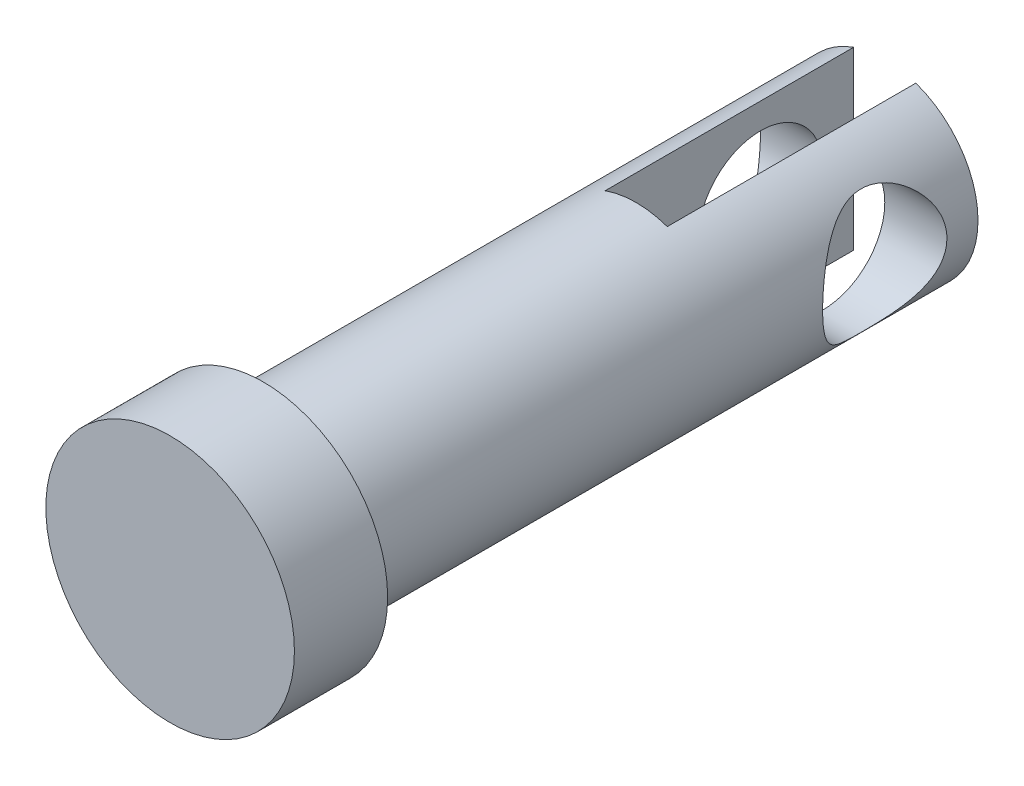
ISO-10303-21;
HEADER;
FILE_DESCRIPTION(('STEP AP214'),'2;1');
FILE_NAME('part.step','',(''),(''),'','','');
FILE_SCHEMA(('AUTOMOTIVE_DESIGN { 1 0 10303 214 1 1 1 1 }'));
ENDSEC;
DATA;
#1=APPLICATION_CONTEXT('core data for automotive mechanical design processes');
#2=APPLICATION_PROTOCOL_DEFINITION('international standard','automotive_design',2000,#1);
#3=PRODUCT_CONTEXT('',#1,'mechanical');
#4=PRODUCT('Part','Part','',(#3));
#5=PRODUCT_RELATED_PRODUCT_CATEGORY('part','',(#4));
#6=PRODUCT_DEFINITION_FORMATION('','',#4);
#7=PRODUCT_DEFINITION_CONTEXT('part definition',#1,'design');
#8=PRODUCT_DEFINITION('design','',#6,#7);
#9=PRODUCT_DEFINITION_SHAPE('','',#8);
#10=(LENGTH_UNIT() NAMED_UNIT(*) SI_UNIT(.MILLI.,.METRE.));
#11=(NAMED_UNIT(*) PLANE_ANGLE_UNIT() SI_UNIT($,.RADIAN.));
#12=(NAMED_UNIT(*) SI_UNIT($,.STERADIAN.) SOLID_ANGLE_UNIT());
#13=UNCERTAINTY_MEASURE_WITH_UNIT(LENGTH_MEASURE(1.E-05),#10,'distance_accuracy_value','');
#14=(GEOMETRIC_REPRESENTATION_CONTEXT(3) GLOBAL_UNCERTAINTY_ASSIGNED_CONTEXT((#13)) GLOBAL_UNIT_ASSIGNED_CONTEXT((#10,
#11,#12)) REPRESENTATION_CONTEXT('',''));
#15=CARTESIAN_POINT('',(0.,0.,0.));
#16=DIRECTION('',(0.,0.,1.));
#17=DIRECTION('',(1.,0.,0.));
#18=AXIS2_PLACEMENT_3D('',#15,#16,#17);
#19=CARTESIAN_POINT('',(0.,0.,0.));
#20=DIRECTION('',(0.,0.,1.));
#21=DIRECTION('',(1.,0.,0.));
#22=AXIS2_PLACEMENT_3D('',#19,#20,#21);
#23=PLANE('',#22);
#24=CARTESIAN_POINT('',(0.,0.,0.));
#25=DIRECTION('',(0.,0.,1.));
#26=DIRECTION('',(1.,0.,0.));
#27=AXIS2_PLACEMENT_3D('',#24,#25,#26);
#28=CIRCLE('',#27,3.);
#29=CARTESIAN_POINT('',(-1.,2.82842712474619,0.));
#30=VERTEX_POINT('',#29);
#31=CARTESIAN_POINT('',(-1.,-2.82842712474619,0.));
#32=VERTEX_POINT('',#31);
#33=EDGE_CURVE('E104',#30,#32,#28,.T.);
#34=ORIENTED_EDGE('',*,*,#33,.F.);
#35=DIRECTION('',(0.,-1.,0.));
#36=VECTOR('',#35,1.);
#37=CARTESIAN_POINT('',(-1.,0.,0.));
#38=LINE('',#37,#36);
#39=EDGE_CURVE('E90',#30,#32,#38,.T.);
#40=ORIENTED_EDGE('',*,*,#39,.T.);
#41=EDGE_LOOP('',(#34,#40));
#42=FACE_BOUND('',#41,.T.);
#43=ADVANCED_FACE('F39',(#42),#23,.F.);
#44=CARTESIAN_POINT('',(0.,0.,20.));
#45=DIRECTION('',(0.,0.,-1.));
#46=DIRECTION('',(-1.,0.,0.));
#47=AXIS2_PLACEMENT_3D('',#44,#45,#46);
#48=CYLINDRICAL_SURFACE('',#47,3.);
#49=CARTESIAN_POINT('',(-3.,0.,5.));
#50=CARTESIAN_POINT('',(-3.0000004164484,-0.100484716668078,5.00000054963247));
#51=CARTESIAN_POINT('',(-2.99490802753388,-0.200969087132901,4.9923860300445));
#52=CARTESIAN_POINT('',(-2.97504652423809,-0.398733058031681,4.96240313589434));
#53=CARTESIAN_POINT('',(-2.96027281581235,-0.496011113955006,4.94002775687671));
#54=CARTESIAN_POINT('',(-2.92250482404708,-0.684212307854248,4.88189228267516));
#55=CARTESIAN_POINT('',(-2.89954905493315,-0.775162872657553,4.84619485999206));
#56=CARTESIAN_POINT('',(-2.8472613787744,-0.949415290997259,4.7629366367285));
#57=CARTESIAN_POINT('',(-2.8179285460551,-1.03271603160967,4.71537411369944));
#58=CARTESIAN_POINT('',(-2.75227329369838,-1.19728470077011,4.60534306263257));
#59=CARTESIAN_POINT('',(-2.71556897579319,-1.27778030546067,4.54195213925711));
#60=CARTESIAN_POINT('',(-2.63982313083466,-1.42772804469274,4.40426995134155));
#61=CARTESIAN_POINT('',(-2.60077830356832,-1.49716405543888,4.32996307016226));
#62=CARTESIAN_POINT('',(-2.51728264678794,-1.63422297745496,4.15894763238733));
#63=CARTESIAN_POINT('',(-2.47295067937795,-1.6998318636275,4.06055434679655));
#64=CARTESIAN_POINT('',(-2.3908414735282,-1.81350357014175,3.85163662235347));
#65=CARTESIAN_POINT('',(-2.35305295954668,-1.86159673426503,3.74113359843726));
#66=CARTESIAN_POINT('',(-2.29976266641461,-1.92674035011438,3.54328870657838));
#67=CARTESIAN_POINT('',(-2.28097627892403,-1.94874447236008,3.45847154712609));
#68=CARTESIAN_POINT('',(-2.25257969659604,-1.98150617785228,3.28525549525835));
#69=CARTESIAN_POINT('',(-2.24295368744147,-1.99228314651963,3.19686305127394));
#70=CARTESIAN_POINT('',(-2.23436605608045,-2.00191364141227,3.01852522114353));
#71=CARTESIAN_POINT('',(-2.23544802558502,-2.00071842917524,2.9285749765476));
#72=CARTESIAN_POINT('',(-2.24819775483425,-1.98637581333356,2.75036502650025));
#73=CARTESIAN_POINT('',(-2.25987448286881,-1.97321828380393,2.66210681797187));
#74=CARTESIAN_POINT('',(-2.29127185989959,-1.93664994217326,2.49353294875812));
#75=CARTESIAN_POINT('',(-2.31061488324375,-1.91371711479477,2.41303866406123));
#76=CARTESIAN_POINT('',(-2.35509622933623,-1.85870118583424,2.25697630902422));
#77=CARTESIAN_POINT('',(-2.3802364585489,-1.8266150732855,2.18140986976135));
#78=CARTESIAN_POINT('',(-2.43964196377947,-1.74673818732648,2.02097460464356));
#79=CARTESIAN_POINT('',(-2.47472317740626,-1.69708052300445,1.93734009951691));
#80=CARTESIAN_POINT('',(-2.54691537733438,-1.58668960438221,1.77861660471425));
#81=CARTESIAN_POINT('',(-2.58402882709328,-1.52594268999614,1.70353834223793));
#82=CARTESIAN_POINT('',(-2.66543343763724,-1.37981165322309,1.54745745439658));
#83=CARTESIAN_POINT('',(-2.7095474472056,-1.29193938283656,1.46866595131724));
#84=CARTESIAN_POINT('',(-2.79218100665212,-1.10200799908008,1.32680350546152));
#85=CARTESIAN_POINT('',(-2.83070577648042,-0.999962299343697,1.26371785459102));
#86=CARTESIAN_POINT('',(-2.89145404090364,-0.804857827096531,1.16652228137713));
#87=CARTESIAN_POINT('',(-2.9153926116554,-0.713957643371911,1.12915663666106));
#88=CARTESIAN_POINT('',(-2.95507719030499,-0.526036043935481,1.06789507437463));
#89=CARTESIAN_POINT('',(-2.97083012127543,-0.42901987900165,1.04398777286779));
#90=CARTESIAN_POINT('',(-2.99275882156808,-0.230985453172281,1.010838834762));
#91=CARTESIAN_POINT('',(-2.99889322461187,-0.129951811934158,1.00166053906174));
#92=CARTESIAN_POINT('',(-3.00083114965147,0.0724415193893463,0.998752911437794));
#93=CARTESIAN_POINT('',(-2.99663539385634,0.173801186186625,1.00502249951123));
#94=CARTESIAN_POINT('',(-2.97899589424273,0.366455717204239,1.03162405556195));
#95=CARTESIAN_POINT('',(-2.96622246390226,0.457957444679193,1.05093729775522));
#96=CARTESIAN_POINT('',(-2.93318449284837,0.636116392427401,1.10159568601286));
#97=CARTESIAN_POINT('',(-2.91291875746989,0.722772837571133,1.13294275092821));
#98=CARTESIAN_POINT('',(-2.86496352529158,0.894664750465997,1.20865229704492));
#99=CARTESIAN_POINT('',(-2.83689870135785,0.979496184631419,1.25368815408186));
#100=CARTESIAN_POINT('',(-2.77601855611511,1.14068302395729,1.35443328994628));
#101=CARTESIAN_POINT('',(-2.74320030403941,1.21703314820091,1.41014916053217));
#102=CARTESIAN_POINT('',(-2.6695454665343,1.37185445482324,1.54060786815751));
#103=CARTESIAN_POINT('',(-2.62826156800165,1.44875187569565,1.61696626007509));
#104=CARTESIAN_POINT('',(-2.54571173085957,1.58933968069449,1.78111142995712));
#105=CARTESIAN_POINT('',(-2.50444582417845,1.6530209365723,1.86890603910751));
#106=CARTESIAN_POINT('',(-2.4293967897058,1.76124776549313,2.04714241276813));
#107=CARTESIAN_POINT('',(-2.39527597025701,1.80695636125283,2.13673203346221));
#108=CARTESIAN_POINT('',(-2.33438974266154,1.88496213740264,2.32387265244363));
#109=CARTESIAN_POINT('',(-2.30761112529822,1.91728345682189,2.42140893830463));
#110=CARTESIAN_POINT('',(-2.26933208182633,1.9623584346534,2.60456448719541));
#111=CARTESIAN_POINT('',(-2.25594998021257,1.97758597566225,2.68917180987601));
#112=CARTESIAN_POINT('',(-2.23879466438398,1.99699205923373,2.86057328131839));
#113=CARTESIAN_POINT('',(-2.23501101347816,2.00118260285317,2.9473649511395));
#114=CARTESIAN_POINT('',(-2.23764201149981,1.99823921981266,3.1206430567237));
#115=CARTESIAN_POINT('',(-2.24406269907463,1.99109858767783,3.20712928137376));
#116=CARTESIAN_POINT('',(-2.26610452403491,1.96596997224746,3.37734352853212));
#117=CARTESIAN_POINT('',(-2.28173793527615,1.94796751728258,3.46106771382433));
#118=CARTESIAN_POINT('',(-2.32526843904801,1.89593035657494,3.64571118648124));
#119=CARTESIAN_POINT('',(-2.35532333574983,1.85890187130765,3.74526771294333));
#120=CARTESIAN_POINT('',(-2.42222161121309,1.7708452623622,3.93548683438421));
#121=CARTESIAN_POINT('',(-2.459074496867,1.71979748341259,4.02613669799169));
#122=CARTESIAN_POINT('',(-2.53617186577119,1.60398280555152,4.19928188713623));
#123=CARTESIAN_POINT('',(-2.5764658739228,1.53898309894021,4.28159874542305));
#124=CARTESIAN_POINT('',(-2.65628301537844,1.39671768031094,4.43532247825793));
#125=CARTESIAN_POINT('',(-2.69580590832396,1.31944821025748,4.50672599702921));
#126=CARTESIAN_POINT('',(-2.77631551964082,1.14145732976974,4.64671210430908));
#127=CARTESIAN_POINT('',(-2.81669805449991,1.03896166955574,4.71341864017832));
#128=CARTESIAN_POINT('',(-2.88777665874161,0.820868555771214,4.8279132766653));
#129=CARTESIAN_POINT('',(-2.91848793445255,0.705292062449155,4.87573110682395));
#130=CARTESIAN_POINT('',(-2.96101644836895,0.491435069835745,4.94115457816378));
#131=CARTESIAN_POINT('',(-2.97551480368935,0.395012325257921,4.96311103909862));
#132=CARTESIAN_POINT('',(-2.99500280141853,0.199058012023946,4.9925280325381));
#133=CARTESIAN_POINT('',(-2.99999958751315,0.0995288361880077,4.99999945559601));
#134=CARTESIAN_POINT('',(-3.,0.,5.));
#135=B_SPLINE_CURVE_WITH_KNOTS('',3,(#49,#50,#51,#52,#53,#54,#55,#56,#57,#58,#59,#60,#61,#62,
#63,#64,#65,#66,#67,#68,#69,#70,#71,#72,#73,#74,#75,#76,#77,#78,#79,#80,#81,#82,#83,#84,#85,#86,
#87,#88,#89,#90,#91,#92,#93,#94,#95,#96,#97,#98,#99,#100,#101,#102,#103,#104,#105,#106,#107,
#108,#109,#110,#111,#112,#113,#114,#115,#116,#117,#118,#119,#120,#121,#122,#123,#124,#125,#126,
#127,#128,#129,#130,#131,#132,#133,#134),.UNSPECIFIED.,.T.,.F.,(4,2,2,2,2,2,2,2,2,2,2,2,2,2,2,2,
2,2,2,2,2,2,2,2,2,2,2,2,2,2,2,2,2,2,2,2,2,2,2,2,2,2,4),(0.,0.301053226505399,0.602249414348688,
0.902046153190231,1.20188643867386,1.52717029000557,1.85292411604318,2.23006683295982,
2.60655305445439,2.87433693676029,3.14165767845809,3.41006711735378,3.67870397263352,
3.93548862198022,4.19235783805078,4.50147574660873,4.81097703780057,5.18718954496752,
5.56304840301362,5.86524087696758,6.16717735142813,6.47040883294251,6.77361911533415,
7.05553084792472,7.3374875513827,7.63652346829516,7.93574454945204,8.28228176141291,
8.62905753175758,8.94649935304476,9.26336626640723,9.52324048016135,9.78283200333091,
10.0425772028455,10.302669238524,10.6320660870419,10.9619271337795,11.2977924520448,
11.6337608397015,12.0179535155883,12.4015390656083,12.6999529136674,12.9981423125957),.UNSPECIFIED.);
#136=CARTESIAN_POINT('',(-3.,0.,5.));
#137=VERTEX_POINT('',#136);
#138=EDGE_CURVE('E125',#137,#137,#135,.T.);
#139=ORIENTED_EDGE('',*,*,#138,.T.);
#140=EDGE_LOOP('',(#139));
#141=FACE_BOUND('',#140,.T.);
#142=CARTESIAN_POINT('',(3.,0.,1.));
#143=CARTESIAN_POINT('',(3.0000004164484,-0.100484716668078,0.999999450367526));
#144=CARTESIAN_POINT('',(2.99490802753388,-0.200969087132901,1.0076139699555));
#145=CARTESIAN_POINT('',(2.97504652423809,-0.398733058031681,1.03759686410566));
#146=CARTESIAN_POINT('',(2.96027281581235,-0.496011113955007,1.05997224312329));
#147=CARTESIAN_POINT('',(2.92250482404708,-0.684212307854249,1.11810771732484));
#148=CARTESIAN_POINT('',(2.89954905493315,-0.775162872657554,1.15380514000794));
#149=CARTESIAN_POINT('',(2.8472613787744,-0.94941529099726,1.2370633632715));
#150=CARTESIAN_POINT('',(2.8179285460551,-1.03271603160967,1.28462588630056));
#151=CARTESIAN_POINT('',(2.75227329369838,-1.19728470077011,1.39465693736743));
#152=CARTESIAN_POINT('',(2.71556897579319,-1.27778030546067,1.45804786074289));
#153=CARTESIAN_POINT('',(2.63982313083466,-1.42772804469274,1.59573004865845));
#154=CARTESIAN_POINT('',(2.60077830356832,-1.49716405543888,1.67003692983774));
#155=CARTESIAN_POINT('',(2.51728264678794,-1.63422297745496,1.84105236761268));
#156=CARTESIAN_POINT('',(2.47295067937795,-1.6998318636275,1.93944565320345));
#157=CARTESIAN_POINT('',(2.3908414735282,-1.81350357014175,2.14836337764653));
#158=CARTESIAN_POINT('',(2.35305295954668,-1.86159673426503,2.25886640156274));
#159=CARTESIAN_POINT('',(2.2997626664146,-1.92674035011438,2.45671129342163));
#160=CARTESIAN_POINT('',(2.28097627892403,-1.94874447236008,2.54152845287391));
#161=CARTESIAN_POINT('',(2.25257969659604,-1.98150617785228,2.71474450474165));
#162=CARTESIAN_POINT('',(2.24295368744147,-1.99228314651963,2.80313694872606));
#163=CARTESIAN_POINT('',(2.23436605608045,-2.00191364141227,2.98147477885647));
#164=CARTESIAN_POINT('',(2.23544802558502,-2.00071842917524,3.0714250234524));
#165=CARTESIAN_POINT('',(2.24819775483425,-1.98637581333356,3.24963497349975));
#166=CARTESIAN_POINT('',(2.25987448286881,-1.97321828380393,3.33789318202813));
#167=CARTESIAN_POINT('',(2.29127185989959,-1.93664994217326,3.50646705124188));
#168=CARTESIAN_POINT('',(2.31061488324375,-1.91371711479477,3.58696133593877));
#169=CARTESIAN_POINT('',(2.35509622933623,-1.85870118583424,3.74302369097578));
#170=CARTESIAN_POINT('',(2.3802364585489,-1.8266150732855,3.81859013023865));
#171=CARTESIAN_POINT('',(2.43964196377947,-1.74673818732648,3.97902539535644));
#172=CARTESIAN_POINT('',(2.47472317740626,-1.69708052300445,4.0626599004831));
#173=CARTESIAN_POINT('',(2.54691537733438,-1.58668960438221,4.22138339528575));
#174=CARTESIAN_POINT('',(2.58402882709328,-1.52594268999614,4.29646165776207));
#175=CARTESIAN_POINT('',(2.66543343763724,-1.37981165322309,4.45254254560342));
#176=CARTESIAN_POINT('',(2.7095474472056,-1.29193938283656,4.53133404868276));
#177=CARTESIAN_POINT('',(2.79218100665212,-1.10200799908008,4.67319649453848));
#178=CARTESIAN_POINT('',(2.83070577648042,-0.999962299343697,4.73628214540898));
#179=CARTESIAN_POINT('',(2.89145404090364,-0.80485782709653,4.83347771862287));
#180=CARTESIAN_POINT('',(2.9153926116554,-0.71395764337191,4.87084336333894));
#181=CARTESIAN_POINT('',(2.95507719030499,-0.526036043935481,4.93210492562537));
#182=CARTESIAN_POINT('',(2.97083012127543,-0.42901987900165,4.95601222713221));
#183=CARTESIAN_POINT('',(2.99275882156808,-0.230985453172281,4.989161165238));
#184=CARTESIAN_POINT('',(2.99889322461187,-0.129951811934158,4.99833946093826));
#185=CARTESIAN_POINT('',(3.00083114965147,0.0724415193893465,5.00124708856221));
#186=CARTESIAN_POINT('',(2.99663539385634,0.173801186186625,4.99497750048877));
#187=CARTESIAN_POINT('',(2.97899589424273,0.366455717204239,4.96837594443805));
#188=CARTESIAN_POINT('',(2.96622246390226,0.457957444679193,4.94906270224478));
#189=CARTESIAN_POINT('',(2.93318449284837,0.636116392427401,4.89840431398714));
#190=CARTESIAN_POINT('',(2.91291875746989,0.722772837571133,4.86705724907179));
#191=CARTESIAN_POINT('',(2.86496352529158,0.894664750465996,4.79134770295508));
#192=CARTESIAN_POINT('',(2.83689870135785,0.979496184631419,4.74631184591814));
#193=CARTESIAN_POINT('',(2.77601855611511,1.14068302395729,4.64556671005372));
#194=CARTESIAN_POINT('',(2.74320030403941,1.21703314820091,4.58985083946783));
#195=CARTESIAN_POINT('',(2.6695454665343,1.37185445482324,4.45939213184249));
#196=CARTESIAN_POINT('',(2.62826156800165,1.44875187569565,4.38303373992491));
#197=CARTESIAN_POINT('',(2.54571173085958,1.58933968069449,4.21888857004288));
#198=CARTESIAN_POINT('',(2.50444582417845,1.6530209365723,4.13109396089249));
#199=CARTESIAN_POINT('',(2.4293967897058,1.76124776549313,3.95285758723187));
#200=CARTESIAN_POINT('',(2.39527597025701,1.80695636125283,3.86326796653779));
#201=CARTESIAN_POINT('',(2.33438974266154,1.88496213740264,3.67612734755637));
#202=CARTESIAN_POINT('',(2.30761112529822,1.91728345682189,3.57859106169537));
#203=CARTESIAN_POINT('',(2.26933208182633,1.9623584346534,3.39543551280459));
#204=CARTESIAN_POINT('',(2.25594998021257,1.97758597566225,3.31082819012399));
#205=CARTESIAN_POINT('',(2.23879466438398,1.99699205923373,3.13942671868161));
#206=CARTESIAN_POINT('',(2.23501101347816,2.00118260285317,3.0526350488605));
#207=CARTESIAN_POINT('',(2.23764201149981,1.99823921981266,2.8793569432763));
#208=CARTESIAN_POINT('',(2.24406269907463,1.99109858767783,2.79287071862624));
#209=CARTESIAN_POINT('',(2.26610452403491,1.96596997224746,2.62265647146788));
#210=CARTESIAN_POINT('',(2.28173793527615,1.94796751728258,2.53893228617567));
#211=CARTESIAN_POINT('',(2.32526843904801,1.89593035657494,2.35428881351876));
#212=CARTESIAN_POINT('',(2.35532333574983,1.85890187130765,2.25473228705667));
#213=CARTESIAN_POINT('',(2.42222161121309,1.7708452623622,2.06451316561579));
#214=CARTESIAN_POINT('',(2.459074496867,1.71979748341259,1.97386330200831));
#215=CARTESIAN_POINT('',(2.53617186577119,1.60398280555152,1.80071811286377));
#216=CARTESIAN_POINT('',(2.5764658739228,1.53898309894021,1.71840125457695));
#217=CARTESIAN_POINT('',(2.65628301537844,1.39671768031094,1.56467752174207));
#218=CARTESIAN_POINT('',(2.69580590832396,1.31944821025748,1.49327400297079));
#219=CARTESIAN_POINT('',(2.77631551964082,1.14145732976974,1.35328789569092));
#220=CARTESIAN_POINT('',(2.81669805449991,1.03896166955574,1.28658135982168));
#221=CARTESIAN_POINT('',(2.88777665874161,0.820868555771214,1.1720867233347));
#222=CARTESIAN_POINT('',(2.91848793445255,0.705292062449154,1.12426889317605));
#223=CARTESIAN_POINT('',(2.96101644836895,0.491435069835744,1.05884542183622));
#224=CARTESIAN_POINT('',(2.97551480368935,0.39501232525792,1.03688896090138));
#225=CARTESIAN_POINT('',(2.99500280141853,0.199058012023945,1.0074719674619));
#226=CARTESIAN_POINT('',(2.99999958751315,0.0995288361880075,1.00000054440399));
#227=CARTESIAN_POINT('',(3.,0.,1.));
#228=B_SPLINE_CURVE_WITH_KNOTS('',3,(#142,#143,#144,#145,#146,#147,#148,#149,#150,#151,#152,
#153,#154,#155,#156,#157,#158,#159,#160,#161,#162,#163,#164,#165,#166,#167,#168,#169,#170,#171,
#172,#173,#174,#175,#176,#177,#178,#179,#180,#181,#182,#183,#184,#185,#186,#187,#188,#189,#190,
#191,#192,#193,#194,#195,#196,#197,#198,#199,#200,#201,#202,#203,#204,#205,#206,#207,#208,#209,
#210,#211,#212,#213,#214,#215,#216,#217,#218,#219,#220,#221,#222,#223,#224,#225,#226,#227),
.UNSPECIFIED.,.T.,.F.,(4,2,2,2,2,2,2,2,2,2,2,2,2,2,2,2,2,2,2,2,2,2,2,2,2,2,2,2,2,2,2,2,2,2,2,2,
2,2,2,2,2,2,4),(0.,0.3010532265054,0.602249414348688,0.902046153190232,1.20188643867386,
1.52717029000557,1.85292411604319,2.23006683295982,2.60655305445439,2.87433693676029,
3.14165767845809,3.41006711735378,3.67870397263352,3.93548862198022,4.19235783805078,
4.50147574660873,4.81097703780057,5.18718954496752,5.56304840301362,5.86524087696758,
6.16717735142813,6.47040883294251,6.77361911533415,7.05553084792472,7.3374875513827,
7.63652346829516,7.93574454945204,8.28228176141291,8.62905753175758,8.94649935304476,
9.26336626640723,9.52324048016135,9.78283200333091,10.0425772028455,10.302669238524,
10.6320660870419,10.9619271337795,11.2977924520448,11.6337608397015,12.0179535155883,
12.4015390656083,12.6999529136674,12.9981423125957),.UNSPECIFIED.);
#229=CARTESIAN_POINT('',(3.,0.,1.));
#230=VERTEX_POINT('',#229);
#231=EDGE_CURVE('E241',#230,#230,#228,.T.);
#232=ORIENTED_EDGE('',*,*,#231,.T.);
#233=EDGE_LOOP('',(#232));
#234=FACE_BOUND('',#233,.T.);
#235=CARTESIAN_POINT('',(0.,0.,8.));
#236=DIRECTION('',(0.,0.,-1.));
#237=DIRECTION('',(-1.,0.,0.));
#238=AXIS2_PLACEMENT_3D('',#235,#236,#237);
#239=CIRCLE('',#238,3.);
#240=CARTESIAN_POINT('',(-1.,2.82842712474619,8.));
#241=VERTEX_POINT('',#240);
#242=CARTESIAN_POINT('',(1.,2.82842712474619,8.));
#243=VERTEX_POINT('',#242);
#244=EDGE_CURVE('E11',#241,#243,#239,.T.);
#245=ORIENTED_EDGE('',*,*,#244,.F.);
#246=DIRECTION('',(0.,0.,-1.));
#247=VECTOR('',#246,1.);
#248=CARTESIAN_POINT('',(-1.,2.82842712474619,20.));
#249=LINE('',#248,#247);
#250=EDGE_CURVE('E65',#241,#30,#249,.T.);
#251=ORIENTED_EDGE('',*,*,#250,.T.);
#252=ORIENTED_EDGE('',*,*,#33,.T.);
#253=DIRECTION('',(0.,0.,-1.));
#254=VECTOR('',#253,1.);
#255=CARTESIAN_POINT('',(-1.,-2.82842712474619,20.));
#256=LINE('',#255,#254);
#257=CARTESIAN_POINT('',(-1.,-2.82842712474619,8.));
#258=VERTEX_POINT('',#257);
#259=EDGE_CURVE('E100',#32,#258,#256,.F.);
#260=ORIENTED_EDGE('',*,*,#259,.T.);
#261=CARTESIAN_POINT('',(1.,-2.82842712474619,8.));
#262=VERTEX_POINT('',#261);
#263=EDGE_CURVE('E50',#262,#258,#239,.T.);
#264=ORIENTED_EDGE('',*,*,#263,.F.);
#265=DIRECTION('',(0.,0.,-1.));
#266=VECTOR('',#265,1.);
#267=CARTESIAN_POINT('',(1.,-2.82842712474619,20.));
#268=LINE('',#267,#266);
#269=CARTESIAN_POINT('',(1.,-2.82842712474619,0.));
#270=VERTEX_POINT('',#269);
#271=EDGE_CURVE('E84',#262,#270,#268,.T.);
#272=ORIENTED_EDGE('',*,*,#271,.T.);
#273=CARTESIAN_POINT('',(1.,2.82842712474619,0.));
#274=VERTEX_POINT('',#273);
#275=EDGE_CURVE('E97',#270,#274,#28,.T.);
#276=ORIENTED_EDGE('',*,*,#275,.T.);
#277=DIRECTION('',(0.,0.,-1.));
#278=VECTOR('',#277,1.);
#279=CARTESIAN_POINT('',(1.,2.82842712474619,20.));
#280=LINE('',#279,#278);
#281=EDGE_CURVE('E57',#274,#243,#280,.F.);
#282=ORIENTED_EDGE('',*,*,#281,.T.);
#283=EDGE_LOOP('',(#245,#251,#252,#260,#264,#272,#276,#282));
#284=FACE_BOUND('',#283,.T.);
#285=CARTESIAN_POINT('',(0.,0.,20.));
#286=DIRECTION('',(0.,0.,1.));
#287=DIRECTION('',(1.,0.,0.));
#288=AXIS2_PLACEMENT_3D('',#285,#286,#287);
#289=CIRCLE('',#288,3.);
#290=CARTESIAN_POINT('',(3.,0.,20.));
#291=VERTEX_POINT('',#290);
#292=EDGE_CURVE('E91',#291,#291,#289,.T.);
#293=ORIENTED_EDGE('',*,*,#292,.F.);
#294=EDGE_LOOP('',(#293));
#295=FACE_BOUND('',#294,.T.);
#296=ADVANCED_FACE('F41',(#141,#234,#284,#295),#48,.T.);
#297=ORIENTED_EDGE('',*,*,#275,.F.);
#298=DIRECTION('',(0.,1.,0.));
#299=VECTOR('',#298,1.);
#300=CARTESIAN_POINT('',(1.,0.,0.));
#301=LINE('',#300,#299);
#302=EDGE_CURVE('E81',#270,#274,#301,.T.);
#303=ORIENTED_EDGE('',*,*,#302,.T.);
#304=EDGE_LOOP('',(#297,#303));
#305=FACE_BOUND('',#304,.T.);
#306=ADVANCED_FACE('F102',(#305),#23,.F.);
#307=CARTESIAN_POINT('',(0.,0.,23.));
#308=DIRECTION('',(0.,0.,-1.));
#309=DIRECTION('',(-1.,0.,0.));
#310=AXIS2_PLACEMENT_3D('',#307,#308,#309);
#311=CYLINDRICAL_SURFACE('',#310,4.);
#312=CARTESIAN_POINT('',(0.,0.,23.));
#313=DIRECTION('',(0.,0.,1.));
#314=DIRECTION('',(1.,0.,0.));
#315=AXIS2_PLACEMENT_3D('',#312,#313,#314);
#316=CIRCLE('',#315,4.);
#317=CARTESIAN_POINT('',(4.,0.,23.));
#318=VERTEX_POINT('',#317);
#319=EDGE_CURVE('E105',#318,#318,#316,.T.);
#320=ORIENTED_EDGE('',*,*,#319,.F.);
#321=EDGE_LOOP('',(#320));
#322=FACE_BOUND('',#321,.T.);
#323=CARTESIAN_POINT('',(0.,0.,20.));
#324=DIRECTION('',(0.,0.,1.));
#325=DIRECTION('',(1.,0.,0.));
#326=AXIS2_PLACEMENT_3D('',#323,#324,#325);
#327=CIRCLE('',#326,4.);
#328=CARTESIAN_POINT('',(4.,0.,20.));
#329=VERTEX_POINT('',#328);
#330=EDGE_CURVE('E111',#329,#329,#327,.T.);
#331=ORIENTED_EDGE('',*,*,#330,.T.);
#332=EDGE_LOOP('',(#331));
#333=FACE_BOUND('',#332,.T.);
#334=ADVANCED_FACE('F137',(#322,#333),#311,.T.);
#335=CARTESIAN_POINT('',(0.,0.,23.));
#336=DIRECTION('',(0.,0.,1.));
#337=DIRECTION('',(1.,0.,0.));
#338=AXIS2_PLACEMENT_3D('',#335,#336,#337);
#339=PLANE('',#338);
#340=ORIENTED_EDGE('',*,*,#319,.T.);
#341=EDGE_LOOP('',(#340));
#342=FACE_BOUND('',#341,.T.);
#343=ADVANCED_FACE('F141',(#342),#339,.T.);
#344=CARTESIAN_POINT('',(0.,0.,20.));
#345=DIRECTION('',(0.,0.,1.));
#346=DIRECTION('',(1.,0.,0.));
#347=AXIS2_PLACEMENT_3D('',#344,#345,#346);
#348=PLANE('',#347);
#349=ORIENTED_EDGE('',*,*,#292,.T.);
#350=EDGE_LOOP('',(#349));
#351=FACE_BOUND('',#350,.T.);
#352=ORIENTED_EDGE('',*,*,#330,.F.);
#353=EDGE_LOOP('',(#352));
#354=FACE_BOUND('',#353,.T.);
#355=ADVANCED_FACE('F139',(#351,#354),#348,.F.);
#356=CARTESIAN_POINT('',(0.,0.,8.));
#357=DIRECTION('',(0.,0.,-1.));
#358=DIRECTION('',(-1.,0.,0.));
#359=AXIS2_PLACEMENT_3D('',#356,#357,#358);
#360=PLANE('',#359);
#361=ORIENTED_EDGE('',*,*,#244,.T.);
#362=DIRECTION('',(0.,-1.,0.));
#363=VECTOR('',#362,1.);
#364=CARTESIAN_POINT('',(1.,3.41764967326651,8.));
#365=LINE('',#364,#363);
#366=EDGE_CURVE('E122',#243,#262,#365,.T.);
#367=ORIENTED_EDGE('',*,*,#366,.T.);
#368=ORIENTED_EDGE('',*,*,#263,.T.);
#369=DIRECTION('',(0.,1.,0.));
#370=VECTOR('',#369,1.);
#371=CARTESIAN_POINT('',(-1.,3.41764967326651,8.));
#372=LINE('',#371,#370);
#373=EDGE_CURVE('E121',#258,#241,#372,.T.);
#374=ORIENTED_EDGE('',*,*,#373,.T.);
#375=EDGE_LOOP('',(#361,#367,#368,#374));
#376=FACE_BOUND('',#375,.T.);
#377=ADVANCED_FACE('F120',(#376),#360,.T.);
#378=CARTESIAN_POINT('',(-1.,3.41764967326651,8.));
#379=DIRECTION('',(-1.,0.,0.));
#380=DIRECTION('',(0.,0.,1.));
#381=AXIS2_PLACEMENT_3D('',#378,#379,#380);
#382=PLANE('',#381);
#383=CARTESIAN_POINT('',(-1.,0.,3.));
#384=DIRECTION('',(-1.,0.,0.));
#385=DIRECTION('',(0.,0.,1.));
#386=AXIS2_PLACEMENT_3D('',#383,#384,#385);
#387=CIRCLE('',#386,2.);
#388=CARTESIAN_POINT('',(-1.,0.,5.));
#389=VERTEX_POINT('',#388);
#390=EDGE_CURVE('E258',#389,#389,#387,.T.);
#391=ORIENTED_EDGE('',*,*,#390,.T.);
#392=EDGE_LOOP('',(#391));
#393=FACE_BOUND('',#392,.T.);
#394=ORIENTED_EDGE('',*,*,#373,.F.);
#395=ORIENTED_EDGE('',*,*,#259,.F.);
#396=ORIENTED_EDGE('',*,*,#39,.F.);
#397=ORIENTED_EDGE('',*,*,#250,.F.);
#398=EDGE_LOOP('',(#394,#395,#396,#397));
#399=FACE_BOUND('',#398,.T.);
#400=ADVANCED_FACE('F123',(#393,#399),#382,.F.);
#401=CARTESIAN_POINT('',(1.,3.41764967326651,8.));
#402=DIRECTION('',(1.,0.,0.));
#403=DIRECTION('',(0.,0.,-1.));
#404=AXIS2_PLACEMENT_3D('',#401,#402,#403);
#405=PLANE('',#404);
#406=CARTESIAN_POINT('',(1.,0.,3.));
#407=DIRECTION('',(1.,0.,0.));
#408=DIRECTION('',(0.,0.,-1.));
#409=AXIS2_PLACEMENT_3D('',#406,#407,#408);
#410=CIRCLE('',#409,2.);
#411=CARTESIAN_POINT('',(1.,0.,1.));
#412=VERTEX_POINT('',#411);
#413=EDGE_CURVE('E44',#412,#412,#410,.T.);
#414=ORIENTED_EDGE('',*,*,#413,.T.);
#415=EDGE_LOOP('',(#414));
#416=FACE_BOUND('',#415,.T.);
#417=ORIENTED_EDGE('',*,*,#366,.F.);
#418=ORIENTED_EDGE('',*,*,#281,.F.);
#419=ORIENTED_EDGE('',*,*,#302,.F.);
#420=ORIENTED_EDGE('',*,*,#271,.F.);
#421=EDGE_LOOP('',(#417,#418,#419,#420));
#422=FACE_BOUND('',#421,.T.);
#423=ADVANCED_FACE('F83',(#416,#422),#405,.F.);
#424=CARTESIAN_POINT('',(-4.,0.,3.));
#425=DIRECTION('',(1.,0.,0.));
#426=DIRECTION('',(0.,0.,-1.));
#427=AXIS2_PLACEMENT_3D('',#424,#425,#426);
#428=CYLINDRICAL_SURFACE('',#427,2.);
#429=ORIENTED_EDGE('',*,*,#413,.F.);
#430=EDGE_LOOP('',(#429));
#431=FACE_BOUND('',#430,.T.);
#432=ORIENTED_EDGE('',*,*,#231,.F.);
#433=EDGE_LOOP('',(#432));
#434=FACE_BOUND('',#433,.T.);
#435=ADVANCED_FACE('F213',(#431,#434),#428,.F.);
#436=ORIENTED_EDGE('',*,*,#390,.F.);
#437=EDGE_LOOP('',(#436));
#438=FACE_BOUND('',#437,.T.);
#439=ORIENTED_EDGE('',*,*,#138,.F.);
#440=EDGE_LOOP('',(#439));
#441=FACE_BOUND('',#440,.T.);
#442=ADVANCED_FACE('F223',(#438,#441),#428,.F.);
#443=CLOSED_SHELL('',(#43,#296,#306,#334,#343,#355,#377,#400,#423,#435,#442));
#444=MANIFOLD_SOLID_BREP('B2',#443);
#445=ADVANCED_BREP_SHAPE_REPRESENTATION('',(#18,#444),#14);
#446=SHAPE_DEFINITION_REPRESENTATION(#9,#445);
ENDSEC;
END-ISO-10303-21;
